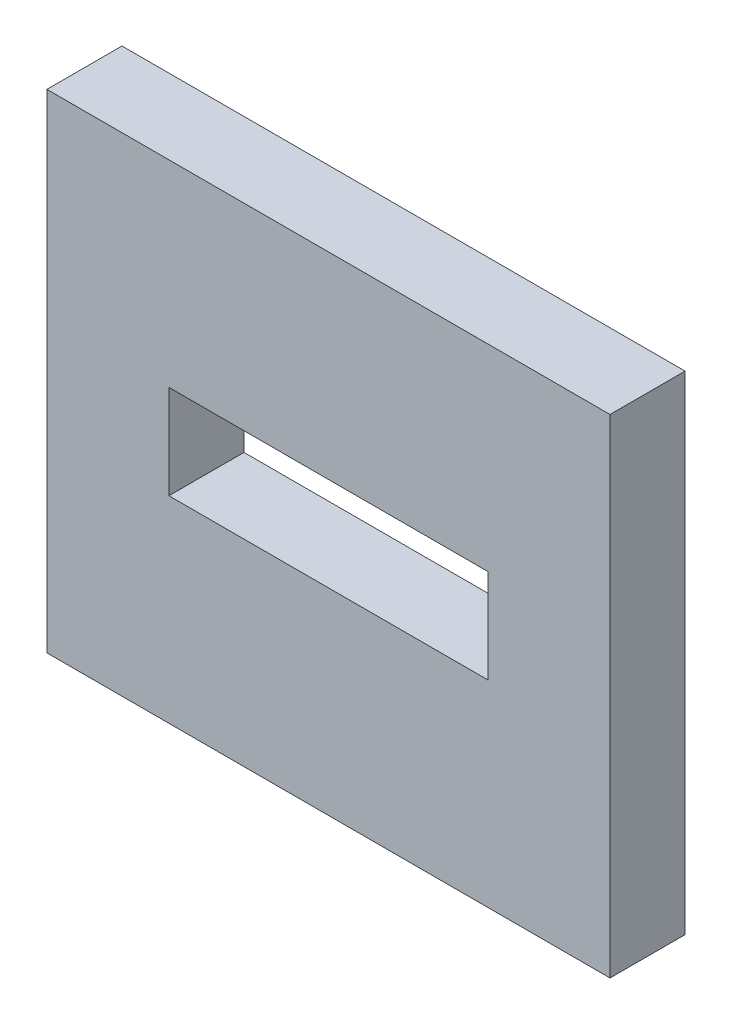
ISO-10303-21;
HEADER;
FILE_DESCRIPTION(('STEP AP214'),'2;1');
FILE_NAME('part.step','',(''),(''),'','','');
FILE_SCHEMA(('AUTOMOTIVE_DESIGN { 1 0 10303 214 1 1 1 1 }'));
ENDSEC;
DATA;
#1=APPLICATION_CONTEXT('core data for automotive mechanical design processes');
#2=APPLICATION_PROTOCOL_DEFINITION('international standard','automotive_design',2000,#1);
#3=PRODUCT_CONTEXT('',#1,'mechanical');
#4=PRODUCT('Part','Part','',(#3));
#5=PRODUCT_RELATED_PRODUCT_CATEGORY('part','',(#4));
#6=PRODUCT_DEFINITION_FORMATION('','',#4);
#7=PRODUCT_DEFINITION_CONTEXT('part definition',#1,'design');
#8=PRODUCT_DEFINITION('design','',#6,#7);
#9=PRODUCT_DEFINITION_SHAPE('','',#8);
#10=(LENGTH_UNIT() NAMED_UNIT(*) SI_UNIT(.MILLI.,.METRE.));
#11=(NAMED_UNIT(*) PLANE_ANGLE_UNIT() SI_UNIT($,.RADIAN.));
#12=(NAMED_UNIT(*) SI_UNIT($,.STERADIAN.) SOLID_ANGLE_UNIT());
#13=UNCERTAINTY_MEASURE_WITH_UNIT(LENGTH_MEASURE(1.E-05),#10,'distance_accuracy_value','');
#14=(GEOMETRIC_REPRESENTATION_CONTEXT(3) GLOBAL_UNCERTAINTY_ASSIGNED_CONTEXT((#13)) GLOBAL_UNIT_ASSIGNED_CONTEXT((#10,
#11,#12)) REPRESENTATION_CONTEXT('',''));
#15=CARTESIAN_POINT('',(0.,0.,0.));
#16=DIRECTION('',(0.,0.,1.));
#17=DIRECTION('',(1.,0.,0.));
#18=AXIS2_PLACEMENT_3D('',#15,#16,#17);
#19=CARTESIAN_POINT('',(0.,0.,2.));
#20=DIRECTION('',(0.,0.,-1.));
#21=DIRECTION('',(-1.,0.,0.));
#22=AXIS2_PLACEMENT_3D('',#19,#20,#21);
#23=PLANE('',#22);
#24=DIRECTION('',(0.,-1.,0.));
#25=VECTOR('',#24,1.);
#26=CARTESIAN_POINT('',(-7.5,-3.54761558441558,2.));
#27=LINE('',#26,#25);
#28=CARTESIAN_POINT('',(-7.5,9.45238441558442,2.));
#29=VERTEX_POINT('',#28);
#30=CARTESIAN_POINT('',(-7.5,-3.54761558441558,2.));
#31=VERTEX_POINT('',#30);
#32=EDGE_CURVE('E153',#29,#31,#27,.T.);
#33=ORIENTED_EDGE('',*,*,#32,.T.);
#34=DIRECTION('',(1.,0.,0.));
#35=VECTOR('',#34,1.);
#36=CARTESIAN_POINT('',(-7.5,-3.54761558441558,2.));
#37=LINE('',#36,#35);
#38=CARTESIAN_POINT('',(7.5,-3.54761558441558,2.));
#39=VERTEX_POINT('',#38);
#40=EDGE_CURVE('E157',#31,#39,#37,.T.);
#41=ORIENTED_EDGE('',*,*,#40,.T.);
#42=DIRECTION('',(0.,1.,0.));
#43=VECTOR('',#42,1.);
#44=CARTESIAN_POINT('',(7.5,-3.54761558441558,2.));
#45=LINE('',#44,#43);
#46=CARTESIAN_POINT('',(7.5,9.45238441558442,2.));
#47=VERTEX_POINT('',#46);
#48=EDGE_CURVE('E161',#39,#47,#45,.T.);
#49=ORIENTED_EDGE('',*,*,#48,.T.);
#50=DIRECTION('',(-1.,0.,0.));
#51=VECTOR('',#50,1.);
#52=CARTESIAN_POINT('',(-7.5,9.45238441558442,2.));
#53=LINE('',#52,#51);
#54=EDGE_CURVE('E164',#47,#29,#53,.T.);
#55=ORIENTED_EDGE('',*,*,#54,.T.);
#56=EDGE_LOOP('',(#33,#41,#49,#55));
#57=FACE_BOUND('',#56,.T.);
#58=DIRECTION('',(0.,-1.,0.));
#59=VECTOR('',#58,1.);
#60=CARTESIAN_POINT('',(-4.25,1.70238441558442,2.));
#61=LINE('',#60,#59);
#62=CARTESIAN_POINT('',(-4.25,4.20238441558442,2.));
#63=VERTEX_POINT('',#62);
#64=CARTESIAN_POINT('',(-4.25,1.70238441558442,2.));
#65=VERTEX_POINT('',#64);
#66=EDGE_CURVE('E105',#63,#65,#61,.T.);
#67=ORIENTED_EDGE('',*,*,#66,.F.);
#68=DIRECTION('',(-1.,0.,0.));
#69=VECTOR('',#68,1.);
#70=CARTESIAN_POINT('',(-4.25,4.20238441558442,2.));
#71=LINE('',#70,#69);
#72=CARTESIAN_POINT('',(4.25,4.20238441558442,2.));
#73=VERTEX_POINT('',#72);
#74=EDGE_CURVE('E131',#73,#63,#71,.T.);
#75=ORIENTED_EDGE('',*,*,#74,.F.);
#76=DIRECTION('',(0.,1.,0.));
#77=VECTOR('',#76,1.);
#78=CARTESIAN_POINT('',(4.25,1.70238441558442,2.));
#79=LINE('',#78,#77);
#80=CARTESIAN_POINT('',(4.25,1.70238441558442,2.));
#81=VERTEX_POINT('',#80);
#82=EDGE_CURVE('E127',#81,#73,#79,.T.);
#83=ORIENTED_EDGE('',*,*,#82,.F.);
#84=DIRECTION('',(1.,0.,0.));
#85=VECTOR('',#84,1.);
#86=CARTESIAN_POINT('',(-4.25,1.70238441558442,2.));
#87=LINE('',#86,#85);
#88=EDGE_CURVE('E114',#65,#81,#87,.T.);
#89=ORIENTED_EDGE('',*,*,#88,.F.);
#90=EDGE_LOOP('',(#67,#75,#83,#89));
#91=FACE_BOUND('',#90,.T.);
#92=ADVANCED_FACE('F39',(#57,#91),#23,.F.);
#93=CARTESIAN_POINT('',(0.,0.,0.));
#94=DIRECTION('',(0.,0.,-1.));
#95=DIRECTION('',(-1.,0.,0.));
#96=AXIS2_PLACEMENT_3D('',#93,#94,#95);
#97=PLANE('',#96);
#98=DIRECTION('',(0.,-1.,0.));
#99=VECTOR('',#98,1.);
#100=CARTESIAN_POINT('',(-7.5,-3.54761558441558,0.));
#101=LINE('',#100,#99);
#102=CARTESIAN_POINT('',(-7.5,9.45238441558442,0.));
#103=VERTEX_POINT('',#102);
#104=CARTESIAN_POINT('',(-7.5,-3.54761558441558,0.));
#105=VERTEX_POINT('',#104);
#106=EDGE_CURVE('E123',#103,#105,#101,.T.);
#107=ORIENTED_EDGE('',*,*,#106,.F.);
#108=DIRECTION('',(-1.,0.,0.));
#109=VECTOR('',#108,1.);
#110=CARTESIAN_POINT('',(-7.5,9.45238441558442,0.));
#111=LINE('',#110,#109);
#112=CARTESIAN_POINT('',(7.5,9.45238441558442,0.));
#113=VERTEX_POINT('',#112);
#114=EDGE_CURVE('E158',#113,#103,#111,.T.);
#115=ORIENTED_EDGE('',*,*,#114,.F.);
#116=DIRECTION('',(0.,1.,0.));
#117=VECTOR('',#116,1.);
#118=CARTESIAN_POINT('',(7.5,-3.54761558441558,0.));
#119=LINE('',#118,#117);
#120=CARTESIAN_POINT('',(7.5,-3.54761558441558,0.));
#121=VERTEX_POINT('',#120);
#122=EDGE_CURVE('E174',#121,#113,#119,.T.);
#123=ORIENTED_EDGE('',*,*,#122,.F.);
#124=DIRECTION('',(1.,0.,0.));
#125=VECTOR('',#124,1.);
#126=CARTESIAN_POINT('',(-7.5,-3.54761558441558,0.));
#127=LINE('',#126,#125);
#128=EDGE_CURVE('E171',#105,#121,#127,.T.);
#129=ORIENTED_EDGE('',*,*,#128,.F.);
#130=EDGE_LOOP('',(#107,#115,#123,#129));
#131=FACE_BOUND('',#130,.T.);
#132=DIRECTION('',(-1.,0.,0.));
#133=VECTOR('',#132,1.);
#134=CARTESIAN_POINT('',(-4.25,4.20238441558442,0.));
#135=LINE('',#134,#133);
#136=CARTESIAN_POINT('',(4.25,4.20238441558442,0.));
#137=VERTEX_POINT('',#136);
#138=CARTESIAN_POINT('',(-4.25,4.20238441558442,0.));
#139=VERTEX_POINT('',#138);
#140=EDGE_CURVE('E115',#137,#139,#135,.T.);
#141=ORIENTED_EDGE('',*,*,#140,.T.);
#142=DIRECTION('',(0.,-1.,0.));
#143=VECTOR('',#142,1.);
#144=CARTESIAN_POINT('',(-4.25,1.70238441558442,0.));
#145=LINE('',#144,#143);
#146=CARTESIAN_POINT('',(-4.25,1.70238441558442,0.));
#147=VERTEX_POINT('',#146);
#148=EDGE_CURVE('E63',#139,#147,#145,.T.);
#149=ORIENTED_EDGE('',*,*,#148,.T.);
#150=DIRECTION('',(1.,0.,0.));
#151=VECTOR('',#150,1.);
#152=CARTESIAN_POINT('',(-4.25,1.70238441558442,0.));
#153=LINE('',#152,#151);
#154=CARTESIAN_POINT('',(4.25,1.70238441558442,0.));
#155=VERTEX_POINT('',#154);
#156=EDGE_CURVE('E121',#147,#155,#153,.T.);
#157=ORIENTED_EDGE('',*,*,#156,.T.);
#158=DIRECTION('',(0.,1.,0.));
#159=VECTOR('',#158,1.);
#160=CARTESIAN_POINT('',(4.25,1.70238441558442,0.));
#161=LINE('',#160,#159);
#162=EDGE_CURVE('E140',#155,#137,#161,.T.);
#163=ORIENTED_EDGE('',*,*,#162,.T.);
#164=EDGE_LOOP('',(#141,#149,#157,#163));
#165=FACE_BOUND('',#164,.T.);
#166=ADVANCED_FACE('F197',(#131,#165),#97,.T.);
#167=CARTESIAN_POINT('',(-7.5,-3.54761558441558,2.));
#168=DIRECTION('',(1.,0.,0.));
#169=DIRECTION('',(0.,0.,-1.));
#170=AXIS2_PLACEMENT_3D('',#167,#168,#169);
#171=PLANE('',#170);
#172=ORIENTED_EDGE('',*,*,#106,.T.);
#173=DIRECTION('',(0.,0.,-1.));
#174=VECTOR('',#173,1.);
#175=CARTESIAN_POINT('',(-7.5,-3.54761558441558,2.));
#176=LINE('',#175,#174);
#177=EDGE_CURVE('E11',#31,#105,#176,.T.);
#178=ORIENTED_EDGE('',*,*,#177,.F.);
#179=ORIENTED_EDGE('',*,*,#32,.F.);
#180=DIRECTION('',(0.,0.,-1.));
#181=VECTOR('',#180,1.);
#182=CARTESIAN_POINT('',(-7.5,9.45238441558442,2.));
#183=LINE('',#182,#181);
#184=EDGE_CURVE('E167',#29,#103,#183,.T.);
#185=ORIENTED_EDGE('',*,*,#184,.T.);
#186=EDGE_LOOP('',(#172,#178,#179,#185));
#187=FACE_BOUND('',#186,.T.);
#188=ADVANCED_FACE('F41',(#187),#171,.F.);
#189=CARTESIAN_POINT('',(-7.5,-3.54761558441558,2.));
#190=DIRECTION('',(0.,1.,0.));
#191=DIRECTION('',(0.,0.,1.));
#192=AXIS2_PLACEMENT_3D('',#189,#190,#191);
#193=PLANE('',#192);
#194=ORIENTED_EDGE('',*,*,#128,.T.);
#195=DIRECTION('',(0.,0.,-1.));
#196=VECTOR('',#195,1.);
#197=CARTESIAN_POINT('',(7.5,-3.54761558441558,2.));
#198=LINE('',#197,#196);
#199=EDGE_CURVE('E48',#39,#121,#198,.T.);
#200=ORIENTED_EDGE('',*,*,#199,.F.);
#201=ORIENTED_EDGE('',*,*,#40,.F.);
#202=ORIENTED_EDGE('',*,*,#177,.T.);
#203=EDGE_LOOP('',(#194,#200,#201,#202));
#204=FACE_BOUND('',#203,.T.);
#205=ADVANCED_FACE('F207',(#204),#193,.F.);
#206=CARTESIAN_POINT('',(7.5,-3.54761558441558,2.));
#207=DIRECTION('',(-1.,0.,0.));
#208=DIRECTION('',(0.,0.,1.));
#209=AXIS2_PLACEMENT_3D('',#206,#207,#208);
#210=PLANE('',#209);
#211=ORIENTED_EDGE('',*,*,#122,.T.);
#212=DIRECTION('',(0.,0.,-1.));
#213=VECTOR('',#212,1.);
#214=CARTESIAN_POINT('',(7.5,9.45238441558442,2.));
#215=LINE('',#214,#213);
#216=EDGE_CURVE('E182',#47,#113,#215,.T.);
#217=ORIENTED_EDGE('',*,*,#216,.F.);
#218=ORIENTED_EDGE('',*,*,#48,.F.);
#219=ORIENTED_EDGE('',*,*,#199,.T.);
#220=EDGE_LOOP('',(#211,#217,#218,#219));
#221=FACE_BOUND('',#220,.T.);
#222=ADVANCED_FACE('F191',(#221),#210,.F.);
#223=CARTESIAN_POINT('',(-7.5,9.45238441558442,2.));
#224=DIRECTION('',(0.,-1.,0.));
#225=DIRECTION('',(0.,0.,-1.));
#226=AXIS2_PLACEMENT_3D('',#223,#224,#225);
#227=PLANE('',#226);
#228=ORIENTED_EDGE('',*,*,#114,.T.);
#229=ORIENTED_EDGE('',*,*,#184,.F.);
#230=ORIENTED_EDGE('',*,*,#54,.F.);
#231=ORIENTED_EDGE('',*,*,#216,.T.);
#232=EDGE_LOOP('',(#228,#229,#230,#231));
#233=FACE_BOUND('',#232,.T.);
#234=ADVANCED_FACE('F201',(#233),#227,.F.);
#235=CARTESIAN_POINT('',(-4.25,1.70238441558442,2.));
#236=DIRECTION('',(1.,0.,0.));
#237=DIRECTION('',(0.,0.,-1.));
#238=AXIS2_PLACEMENT_3D('',#235,#236,#237);
#239=PLANE('',#238);
#240=ORIENTED_EDGE('',*,*,#148,.F.);
#241=DIRECTION('',(0.,0.,-1.));
#242=VECTOR('',#241,1.);
#243=CARTESIAN_POINT('',(-4.25,4.20238441558442,2.));
#244=LINE('',#243,#242);
#245=EDGE_CURVE('E109',#63,#139,#244,.T.);
#246=ORIENTED_EDGE('',*,*,#245,.F.);
#247=ORIENTED_EDGE('',*,*,#66,.T.);
#248=DIRECTION('',(0.,0.,-1.));
#249=VECTOR('',#248,1.);
#250=CARTESIAN_POINT('',(-4.25,1.70238441558442,2.));
#251=LINE('',#250,#249);
#252=EDGE_CURVE('E108',#65,#147,#251,.T.);
#253=ORIENTED_EDGE('',*,*,#252,.T.);
#254=EDGE_LOOP('',(#240,#246,#247,#253));
#255=FACE_BOUND('',#254,.T.);
#256=ADVANCED_FACE('F107',(#255),#239,.T.);
#257=CARTESIAN_POINT('',(-4.25,1.70238441558442,2.));
#258=DIRECTION('',(0.,1.,0.));
#259=DIRECTION('',(0.,0.,1.));
#260=AXIS2_PLACEMENT_3D('',#257,#258,#259);
#261=PLANE('',#260);
#262=ORIENTED_EDGE('',*,*,#156,.F.);
#263=ORIENTED_EDGE('',*,*,#252,.F.);
#264=ORIENTED_EDGE('',*,*,#88,.T.);
#265=DIRECTION('',(0.,0.,-1.));
#266=VECTOR('',#265,1.);
#267=CARTESIAN_POINT('',(4.25,1.70238441558442,2.));
#268=LINE('',#267,#266);
#269=EDGE_CURVE('E124',#81,#155,#268,.T.);
#270=ORIENTED_EDGE('',*,*,#269,.T.);
#271=EDGE_LOOP('',(#262,#263,#264,#270));
#272=FACE_BOUND('',#271,.T.);
#273=ADVANCED_FACE('F118',(#272),#261,.T.);
#274=CARTESIAN_POINT('',(4.25,1.70238441558442,2.));
#275=DIRECTION('',(-1.,0.,0.));
#276=DIRECTION('',(0.,0.,1.));
#277=AXIS2_PLACEMENT_3D('',#274,#275,#276);
#278=PLANE('',#277);
#279=ORIENTED_EDGE('',*,*,#162,.F.);
#280=ORIENTED_EDGE('',*,*,#269,.F.);
#281=ORIENTED_EDGE('',*,*,#82,.T.);
#282=DIRECTION('',(0.,0.,-1.));
#283=VECTOR('',#282,1.);
#284=CARTESIAN_POINT('',(4.25,4.20238441558442,2.));
#285=LINE('',#284,#283);
#286=EDGE_CURVE('E55',#73,#137,#285,.T.);
#287=ORIENTED_EDGE('',*,*,#286,.T.);
#288=EDGE_LOOP('',(#279,#280,#281,#287));
#289=FACE_BOUND('',#288,.T.);
#290=ADVANCED_FACE('F230',(#289),#278,.T.);
#291=CARTESIAN_POINT('',(-4.25,4.20238441558442,2.));
#292=DIRECTION('',(0.,-1.,0.));
#293=DIRECTION('',(0.,0.,-1.));
#294=AXIS2_PLACEMENT_3D('',#291,#292,#293);
#295=PLANE('',#294);
#296=ORIENTED_EDGE('',*,*,#140,.F.);
#297=ORIENTED_EDGE('',*,*,#286,.F.);
#298=ORIENTED_EDGE('',*,*,#74,.T.);
#299=ORIENTED_EDGE('',*,*,#245,.T.);
#300=EDGE_LOOP('',(#296,#297,#298,#299));
#301=FACE_BOUND('',#300,.T.);
#302=ADVANCED_FACE('F234',(#301),#295,.T.);
#303=CLOSED_SHELL('',(#92,#166,#188,#205,#222,#234,#256,#273,#290,#302));
#304=MANIFOLD_SOLID_BREP('B2',#303);
#305=ADVANCED_BREP_SHAPE_REPRESENTATION('',(#18,#304),#14);
#306=SHAPE_DEFINITION_REPRESENTATION(#9,#305);
ENDSEC;
END-ISO-10303-21;
